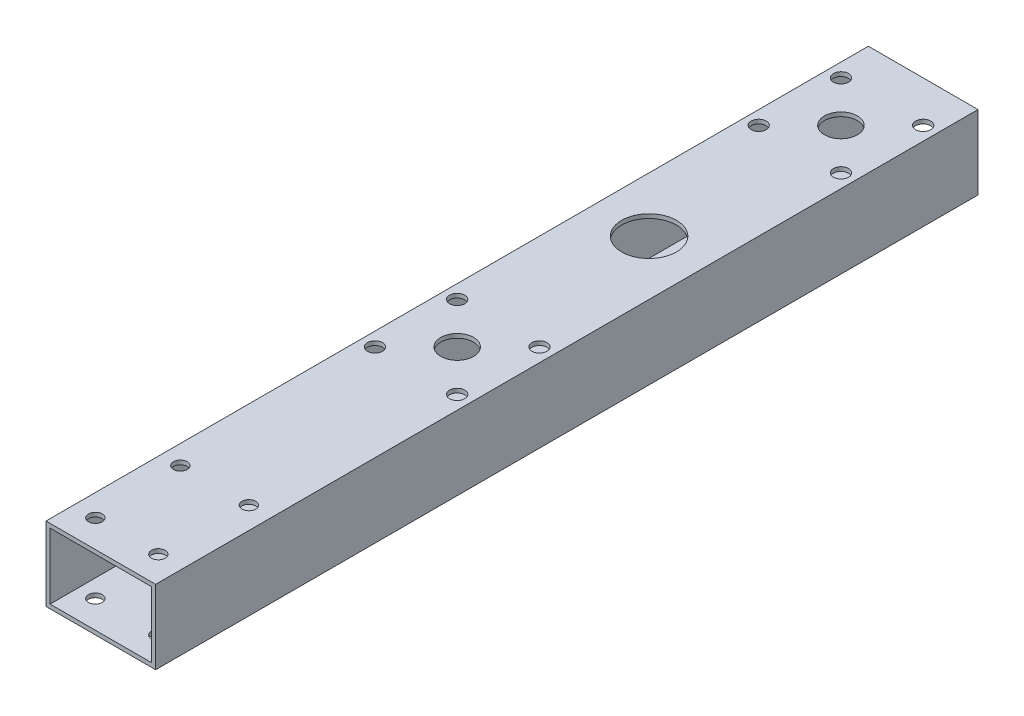
ISO-10303-21;
HEADER;
FILE_DESCRIPTION(('STEP AP214'),'2;1');
FILE_NAME('part.step','',(''),(''),'','','');
FILE_SCHEMA(('AUTOMOTIVE_DESIGN { 1 0 10303 214 1 1 1 1 }'));
ENDSEC;
DATA;
#1=APPLICATION_CONTEXT('core data for automotive mechanical design processes');
#2=APPLICATION_PROTOCOL_DEFINITION('international standard','automotive_design',2000,#1);
#3=PRODUCT_CONTEXT('',#1,'mechanical');
#4=PRODUCT('Part','Part','',(#3));
#5=PRODUCT_RELATED_PRODUCT_CATEGORY('part','',(#4));
#6=PRODUCT_DEFINITION_FORMATION('','',#4);
#7=PRODUCT_DEFINITION_CONTEXT('part definition',#1,'design');
#8=PRODUCT_DEFINITION('design','',#6,#7);
#9=PRODUCT_DEFINITION_SHAPE('','',#8);
#10=(LENGTH_UNIT() NAMED_UNIT(*) SI_UNIT(.MILLI.,.METRE.));
#11=(NAMED_UNIT(*) PLANE_ANGLE_UNIT() SI_UNIT($,.RADIAN.));
#12=(NAMED_UNIT(*) SI_UNIT($,.STERADIAN.) SOLID_ANGLE_UNIT());
#13=UNCERTAINTY_MEASURE_WITH_UNIT(LENGTH_MEASURE(1.E-05),#10,'distance_accuracy_value','');
#14=(GEOMETRIC_REPRESENTATION_CONTEXT(3) GLOBAL_UNCERTAINTY_ASSIGNED_CONTEXT((#13)) GLOBAL_UNIT_ASSIGNED_CONTEXT((#10,
#11,#12)) REPRESENTATION_CONTEXT('',''));
#15=CARTESIAN_POINT('',(0.,0.,0.));
#16=DIRECTION('',(0.,0.,1.));
#17=DIRECTION('',(1.,0.,0.));
#18=AXIS2_PLACEMENT_3D('',#15,#16,#17);
#19=CARTESIAN_POINT('',(0.,0.,300.));
#20=DIRECTION('',(0.,1.,0.));
#21=DIRECTION('',(0.,0.,1.));
#22=AXIS2_PLACEMENT_3D('',#19,#20,#21);
#23=PLANE('',#22);
#24=CARTESIAN_POINT('',(20.,0.,170.));
#25=DIRECTION('',(0.,1.,0.));
#26=DIRECTION('',(0.,0.,-1.));
#27=AXIS2_PLACEMENT_3D('',#24,#25,#26);
#28=CIRCLE('',#27,6.00000000000001);
#29=CARTESIAN_POINT('',(20.,0.,164.));
#30=VERTEX_POINT('',#29);
#31=EDGE_CURVE('E238',#30,#30,#28,.T.);
#32=ORIENTED_EDGE('',*,*,#31,.T.);
#33=EDGE_LOOP('',(#32));
#34=FACE_BOUND('',#33,.T.);
#35=CARTESIAN_POINT('',(5.,0.,45.));
#36=DIRECTION('',(0.,1.,0.));
#37=DIRECTION('',(0.,0.,1.));
#38=AXIS2_PLACEMENT_3D('',#35,#36,#37);
#39=CIRCLE('',#38,2.75);
#40=CARTESIAN_POINT('',(5.,0.,47.75));
#41=VERTEX_POINT('',#40);
#42=EDGE_CURVE('E254',#41,#41,#39,.T.);
#43=ORIENTED_EDGE('',*,*,#42,.T.);
#44=EDGE_LOOP('',(#43));
#45=FACE_BOUND('',#44,.T.);
#46=CARTESIAN_POINT('',(35.,0.,15.));
#47=DIRECTION('',(0.,1.,0.));
#48=DIRECTION('',(0.,0.,1.));
#49=AXIS2_PLACEMENT_3D('',#46,#47,#48);
#50=CIRCLE('',#49,2.75);
#51=CARTESIAN_POINT('',(35.,0.,17.75));
#52=VERTEX_POINT('',#51);
#53=EDGE_CURVE('E268',#52,#52,#50,.T.);
#54=ORIENTED_EDGE('',*,*,#53,.T.);
#55=EDGE_LOOP('',(#54));
#56=FACE_BOUND('',#55,.T.);
#57=CARTESIAN_POINT('',(35.,0.,185.));
#58=DIRECTION('',(0.,1.,0.));
#59=DIRECTION('',(0.,0.,-1.));
#60=AXIS2_PLACEMENT_3D('',#57,#58,#59);
#61=CIRCLE('',#60,2.75);
#62=CARTESIAN_POINT('',(35.,0.,182.25));
#63=VERTEX_POINT('',#62);
#64=EDGE_CURVE('E282',#63,#63,#61,.T.);
#65=ORIENTED_EDGE('',*,*,#64,.T.);
#66=EDGE_LOOP('',(#65));
#67=FACE_BOUND('',#66,.T.);
#68=CARTESIAN_POINT('',(20.,0.,100.));
#69=DIRECTION('',(0.,1.,0.));
#70=DIRECTION('',(0.,0.,1.));
#71=AXIS2_PLACEMENT_3D('',#68,#69,#70);
#72=CIRCLE('',#71,10.);
#73=CARTESIAN_POINT('',(20.,0.,110.));
#74=VERTEX_POINT('',#73);
#75=EDGE_CURVE('E296',#74,#74,#72,.T.);
#76=ORIENTED_EDGE('',*,*,#75,.T.);
#77=EDGE_LOOP('',(#76));
#78=FACE_BOUND('',#77,.T.);
#79=CARTESIAN_POINT('',(31.,0.,290.));
#80=DIRECTION('',(0.,1.,0.));
#81=DIRECTION('',(0.,0.,-1.));
#82=AXIS2_PLACEMENT_3D('',#79,#80,#81);
#83=CIRCLE('',#82,2.5);
#84=CARTESIAN_POINT('',(31.,0.,287.5));
#85=VERTEX_POINT('',#84);
#86=EDGE_CURVE('E310',#85,#85,#83,.T.);
#87=ORIENTED_EDGE('',*,*,#86,.T.);
#88=EDGE_LOOP('',(#87));
#89=FACE_BOUND('',#88,.T.);
#90=CARTESIAN_POINT('',(32.,0.,258.));
#91=DIRECTION('',(0.,1.,0.));
#92=DIRECTION('',(0.,0.,1.));
#93=AXIS2_PLACEMENT_3D('',#90,#91,#92);
#94=CIRCLE('',#93,2.5);
#95=CARTESIAN_POINT('',(32.,0.,260.5));
#96=VERTEX_POINT('',#95);
#97=EDGE_CURVE('E324',#96,#96,#94,.T.);
#98=ORIENTED_EDGE('',*,*,#97,.T.);
#99=EDGE_LOOP('',(#98));
#100=FACE_BOUND('',#99,.T.);
#101=DIRECTION('',(1.,0.,0.));
#102=VECTOR('',#101,1.);
#103=CARTESIAN_POINT('',(0.,0.,0.));
#104=LINE('',#103,#102);
#105=CARTESIAN_POINT('',(0.,0.,0.));
#106=VERTEX_POINT('',#105);
#107=CARTESIAN_POINT('',(40.,0.,0.));
#108=VERTEX_POINT('',#107);
#109=EDGE_CURVE('E153',#106,#108,#104,.T.);
#110=ORIENTED_EDGE('',*,*,#109,.T.);
#111=DIRECTION('',(0.,0.,-1.));
#112=VECTOR('',#111,1.);
#113=CARTESIAN_POINT('',(40.,0.,300.));
#114=LINE('',#113,#112);
#115=CARTESIAN_POINT('',(40.,0.,300.));
#116=VERTEX_POINT('',#115);
#117=EDGE_CURVE('E42',#116,#108,#114,.T.);
#118=ORIENTED_EDGE('',*,*,#117,.F.);
#119=DIRECTION('',(1.,0.,0.));
#120=VECTOR('',#119,1.);
#121=CARTESIAN_POINT('',(0.,0.,300.));
#122=LINE('',#121,#120);
#123=CARTESIAN_POINT('',(0.,0.,300.));
#124=VERTEX_POINT('',#123);
#125=EDGE_CURVE('E143',#124,#116,#122,.T.);
#126=ORIENTED_EDGE('',*,*,#125,.F.);
#127=DIRECTION('',(0.,0.,-1.));
#128=VECTOR('',#127,1.);
#129=CARTESIAN_POINT('',(0.,0.,300.));
#130=LINE('',#129,#128);
#131=EDGE_CURVE('E11',#124,#106,#130,.T.);
#132=ORIENTED_EDGE('',*,*,#131,.T.);
#133=EDGE_LOOP('',(#110,#118,#126,#132));
#134=FACE_BOUND('',#133,.T.);
#135=CARTESIAN_POINT('',(8.,0.,290.));
#136=DIRECTION('',(0.,1.,0.));
#137=DIRECTION('',(0.,0.,1.));
#138=AXIS2_PLACEMENT_3D('',#135,#136,#137);
#139=CIRCLE('',#138,2.5);
#140=CARTESIAN_POINT('',(8.,0.,292.5));
#141=VERTEX_POINT('',#140);
#142=EDGE_CURVE('E331',#141,#141,#139,.T.);
#143=ORIENTED_EDGE('',*,*,#142,.T.);
#144=EDGE_LOOP('',(#143));
#145=FACE_BOUND('',#144,.T.);
#146=CARTESIAN_POINT('',(7.,0.,258.));
#147=DIRECTION('',(0.,1.,0.));
#148=DIRECTION('',(0.,0.,-1.));
#149=AXIS2_PLACEMENT_3D('',#146,#147,#148);
#150=CIRCLE('',#149,2.5);
#151=CARTESIAN_POINT('',(7.,0.,255.5));
#152=VERTEX_POINT('',#151);
#153=EDGE_CURVE('E317',#152,#152,#150,.T.);
#154=ORIENTED_EDGE('',*,*,#153,.T.);
#155=EDGE_LOOP('',(#154));
#156=FACE_BOUND('',#155,.T.);
#157=CARTESIAN_POINT('',(20.,0.,30.));
#158=DIRECTION('',(0.,1.,0.));
#159=DIRECTION('',(0.,0.,1.));
#160=AXIS2_PLACEMENT_3D('',#157,#158,#159);
#161=CIRCLE('',#160,6.00000000000001);
#162=CARTESIAN_POINT('',(20.,0.,36.));
#163=VERTEX_POINT('',#162);
#164=EDGE_CURVE('E303',#163,#163,#161,.T.);
#165=ORIENTED_EDGE('',*,*,#164,.T.);
#166=EDGE_LOOP('',(#165));
#167=FACE_BOUND('',#166,.T.);
#168=CARTESIAN_POINT('',(4.99999999999997,0.,185.));
#169=DIRECTION('',(0.,1.,0.));
#170=DIRECTION('',(0.,0.,-1.));
#171=AXIS2_PLACEMENT_3D('',#168,#169,#170);
#172=CIRCLE('',#171,2.75);
#173=CARTESIAN_POINT('',(4.99999999999997,0.,182.25));
#174=VERTEX_POINT('',#173);
#175=EDGE_CURVE('E289',#174,#174,#172,.T.);
#176=ORIENTED_EDGE('',*,*,#175,.T.);
#177=EDGE_LOOP('',(#176));
#178=FACE_BOUND('',#177,.T.);
#179=CARTESIAN_POINT('',(5.,0.,15.));
#180=DIRECTION('',(0.,1.,0.));
#181=DIRECTION('',(0.,0.,1.));
#182=AXIS2_PLACEMENT_3D('',#179,#180,#181);
#183=CIRCLE('',#182,2.75);
#184=CARTESIAN_POINT('',(5.,0.,17.75));
#185=VERTEX_POINT('',#184);
#186=EDGE_CURVE('E275',#185,#185,#183,.T.);
#187=ORIENTED_EDGE('',*,*,#186,.T.);
#188=EDGE_LOOP('',(#187));
#189=FACE_BOUND('',#188,.T.);
#190=CARTESIAN_POINT('',(35.,0.,45.));
#191=DIRECTION('',(0.,1.,0.));
#192=DIRECTION('',(0.,0.,1.));
#193=AXIS2_PLACEMENT_3D('',#190,#191,#192);
#194=CIRCLE('',#193,2.75);
#195=CARTESIAN_POINT('',(35.,0.,47.75));
#196=VERTEX_POINT('',#195);
#197=EDGE_CURVE('E261',#196,#196,#194,.T.);
#198=ORIENTED_EDGE('',*,*,#197,.T.);
#199=EDGE_LOOP('',(#198));
#200=FACE_BOUND('',#199,.T.);
#201=CARTESIAN_POINT('',(35.,0.,155.));
#202=DIRECTION('',(0.,1.,0.));
#203=DIRECTION('',(0.,0.,-1.));
#204=AXIS2_PLACEMENT_3D('',#201,#202,#203);
#205=CIRCLE('',#204,2.75);
#206=CARTESIAN_POINT('',(35.,0.,152.25));
#207=VERTEX_POINT('',#206);
#208=EDGE_CURVE('E235',#207,#207,#205,.T.);
#209=ORIENTED_EDGE('',*,*,#208,.T.);
#210=EDGE_LOOP('',(#209));
#211=FACE_BOUND('',#210,.T.);
#212=CARTESIAN_POINT('',(4.99999999999997,0.,155.));
#213=DIRECTION('',(0.,1.,0.));
#214=DIRECTION('',(0.,0.,-1.));
#215=AXIS2_PLACEMENT_3D('',#212,#213,#214);
#216=CIRCLE('',#215,2.75);
#217=CARTESIAN_POINT('',(4.99999999999997,0.,152.25));
#218=VERTEX_POINT('',#217);
#219=EDGE_CURVE('E365',#218,#218,#216,.T.);
#220=ORIENTED_EDGE('',*,*,#219,.T.);
#221=EDGE_LOOP('',(#220));
#222=FACE_BOUND('',#221,.T.);
#223=ADVANCED_FACE('F33',(#34,#45,#56,#67,#78,#89,#100,#134,#145,#156,#167,#178,#189,#200,#211,
#222),#23,.F.);
#224=CARTESIAN_POINT('',(0.,27.,300.));
#225=DIRECTION('',(0.,-1.,0.));
#226=DIRECTION('',(0.,0.,-1.));
#227=AXIS2_PLACEMENT_3D('',#224,#225,#226);
#228=PLANE('',#227);
#229=CARTESIAN_POINT('',(20.,27.,170.));
#230=DIRECTION('',(0.,1.,0.));
#231=DIRECTION('',(0.,0.,-1.));
#232=AXIS2_PLACEMENT_3D('',#229,#230,#231);
#233=CIRCLE('',#232,6.00000000000001);
#234=CARTESIAN_POINT('',(20.,27.,164.));
#235=VERTEX_POINT('',#234);
#236=EDGE_CURVE('E231',#235,#235,#233,.T.);
#237=ORIENTED_EDGE('',*,*,#236,.F.);
#238=EDGE_LOOP('',(#237));
#239=FACE_BOUND('',#238,.T.);
#240=CARTESIAN_POINT('',(5.,27.,45.));
#241=DIRECTION('',(0.,1.,0.));
#242=DIRECTION('',(0.,0.,1.));
#243=AXIS2_PLACEMENT_3D('',#240,#241,#242);
#244=CIRCLE('',#243,2.75);
#245=CARTESIAN_POINT('',(5.,27.,47.75));
#246=VERTEX_POINT('',#245);
#247=EDGE_CURVE('E223',#246,#246,#244,.T.);
#248=ORIENTED_EDGE('',*,*,#247,.F.);
#249=EDGE_LOOP('',(#248));
#250=FACE_BOUND('',#249,.T.);
#251=CARTESIAN_POINT('',(35.,27.,15.));
#252=DIRECTION('',(0.,1.,0.));
#253=DIRECTION('',(0.,0.,1.));
#254=AXIS2_PLACEMENT_3D('',#251,#252,#253);
#255=CIRCLE('',#254,2.75);
#256=CARTESIAN_POINT('',(35.,27.,17.75));
#257=VERTEX_POINT('',#256);
#258=EDGE_CURVE('E213',#257,#257,#255,.T.);
#259=ORIENTED_EDGE('',*,*,#258,.F.);
#260=EDGE_LOOP('',(#259));
#261=FACE_BOUND('',#260,.T.);
#262=CARTESIAN_POINT('',(35.,27.,185.));
#263=DIRECTION('',(0.,1.,0.));
#264=DIRECTION('',(0.,0.,-1.));
#265=AXIS2_PLACEMENT_3D('',#262,#263,#264);
#266=CIRCLE('',#265,2.75);
#267=CARTESIAN_POINT('',(35.,27.,182.25));
#268=VERTEX_POINT('',#267);
#269=EDGE_CURVE('E203',#268,#268,#266,.T.);
#270=ORIENTED_EDGE('',*,*,#269,.F.);
#271=EDGE_LOOP('',(#270));
#272=FACE_BOUND('',#271,.T.);
#273=CARTESIAN_POINT('',(20.,27.,100.));
#274=DIRECTION('',(0.,1.,0.));
#275=DIRECTION('',(0.,0.,1.));
#276=AXIS2_PLACEMENT_3D('',#273,#274,#275);
#277=CIRCLE('',#276,10.);
#278=CARTESIAN_POINT('',(20.,27.,110.));
#279=VERTEX_POINT('',#278);
#280=EDGE_CURVE('E193',#279,#279,#277,.T.);
#281=ORIENTED_EDGE('',*,*,#280,.F.);
#282=EDGE_LOOP('',(#281));
#283=FACE_BOUND('',#282,.T.);
#284=CARTESIAN_POINT('',(31.,27.,290.));
#285=DIRECTION('',(0.,1.,0.));
#286=DIRECTION('',(0.,0.,-1.));
#287=AXIS2_PLACEMENT_3D('',#284,#285,#286);
#288=CIRCLE('',#287,2.5);
#289=CARTESIAN_POINT('',(31.,27.,287.5));
#290=VERTEX_POINT('',#289);
#291=EDGE_CURVE('E183',#290,#290,#288,.T.);
#292=ORIENTED_EDGE('',*,*,#291,.F.);
#293=EDGE_LOOP('',(#292));
#294=FACE_BOUND('',#293,.T.);
#295=CARTESIAN_POINT('',(32.,27.,258.));
#296=DIRECTION('',(0.,1.,0.));
#297=DIRECTION('',(0.,0.,1.));
#298=AXIS2_PLACEMENT_3D('',#295,#296,#297);
#299=CIRCLE('',#298,2.5);
#300=CARTESIAN_POINT('',(32.,27.,260.5));
#301=VERTEX_POINT('',#300);
#302=EDGE_CURVE('E173',#301,#301,#299,.T.);
#303=ORIENTED_EDGE('',*,*,#302,.F.);
#304=EDGE_LOOP('',(#303));
#305=FACE_BOUND('',#304,.T.);
#306=DIRECTION('',(-1.,0.,0.));
#307=VECTOR('',#306,1.);
#308=CARTESIAN_POINT('',(0.,27.,0.));
#309=LINE('',#308,#307);
#310=CARTESIAN_POINT('',(40.,27.,0.));
#311=VERTEX_POINT('',#310);
#312=CARTESIAN_POINT('',(0.,27.,0.));
#313=VERTEX_POINT('',#312);
#314=EDGE_CURVE('E144',#311,#313,#309,.T.);
#315=ORIENTED_EDGE('',*,*,#314,.T.);
#316=DIRECTION('',(0.,0.,-1.));
#317=VECTOR('',#316,1.);
#318=CARTESIAN_POINT('',(0.,27.,300.));
#319=LINE('',#318,#317);
#320=CARTESIAN_POINT('',(0.,27.,300.));
#321=VERTEX_POINT('',#320);
#322=EDGE_CURVE('E150',#321,#313,#319,.T.);
#323=ORIENTED_EDGE('',*,*,#322,.F.);
#324=DIRECTION('',(-1.,0.,0.));
#325=VECTOR('',#324,1.);
#326=CARTESIAN_POINT('',(0.,27.,300.));
#327=LINE('',#326,#325);
#328=CARTESIAN_POINT('',(40.,27.,300.));
#329=VERTEX_POINT('',#328);
#330=EDGE_CURVE('E148',#329,#321,#327,.T.);
#331=ORIENTED_EDGE('',*,*,#330,.F.);
#332=DIRECTION('',(0.,0.,-1.));
#333=VECTOR('',#332,1.);
#334=CARTESIAN_POINT('',(40.,27.,300.));
#335=LINE('',#334,#333);
#336=EDGE_CURVE('E160',#329,#311,#335,.T.);
#337=ORIENTED_EDGE('',*,*,#336,.T.);
#338=EDGE_LOOP('',(#315,#323,#331,#337));
#339=FACE_BOUND('',#338,.T.);
#340=CARTESIAN_POINT('',(8.,27.,290.));
#341=DIRECTION('',(0.,1.,0.));
#342=DIRECTION('',(0.,0.,1.));
#343=AXIS2_PLACEMENT_3D('',#340,#341,#342);
#344=CIRCLE('',#343,2.5);
#345=CARTESIAN_POINT('',(8.,27.,292.5));
#346=VERTEX_POINT('',#345);
#347=EDGE_CURVE('E168',#346,#346,#344,.T.);
#348=ORIENTED_EDGE('',*,*,#347,.F.);
#349=EDGE_LOOP('',(#348));
#350=FACE_BOUND('',#349,.T.);
#351=CARTESIAN_POINT('',(7.,27.,258.));
#352=DIRECTION('',(0.,1.,0.));
#353=DIRECTION('',(0.,0.,-1.));
#354=AXIS2_PLACEMENT_3D('',#351,#352,#353);
#355=CIRCLE('',#354,2.5);
#356=CARTESIAN_POINT('',(7.,27.,255.5));
#357=VERTEX_POINT('',#356);
#358=EDGE_CURVE('E178',#357,#357,#355,.T.);
#359=ORIENTED_EDGE('',*,*,#358,.F.);
#360=EDGE_LOOP('',(#359));
#361=FACE_BOUND('',#360,.T.);
#362=CARTESIAN_POINT('',(20.,27.,30.));
#363=DIRECTION('',(0.,1.,0.));
#364=DIRECTION('',(0.,0.,1.));
#365=AXIS2_PLACEMENT_3D('',#362,#363,#364);
#366=CIRCLE('',#365,6.00000000000001);
#367=CARTESIAN_POINT('',(20.,27.,36.));
#368=VERTEX_POINT('',#367);
#369=EDGE_CURVE('E188',#368,#368,#366,.T.);
#370=ORIENTED_EDGE('',*,*,#369,.F.);
#371=EDGE_LOOP('',(#370));
#372=FACE_BOUND('',#371,.T.);
#373=CARTESIAN_POINT('',(4.99999999999997,27.,185.));
#374=DIRECTION('',(0.,1.,0.));
#375=DIRECTION('',(0.,0.,-1.));
#376=AXIS2_PLACEMENT_3D('',#373,#374,#375);
#377=CIRCLE('',#376,2.75);
#378=CARTESIAN_POINT('',(4.99999999999997,27.,182.25));
#379=VERTEX_POINT('',#378);
#380=EDGE_CURVE('E198',#379,#379,#377,.T.);
#381=ORIENTED_EDGE('',*,*,#380,.F.);
#382=EDGE_LOOP('',(#381));
#383=FACE_BOUND('',#382,.T.);
#384=CARTESIAN_POINT('',(5.,27.,15.));
#385=DIRECTION('',(0.,1.,0.));
#386=DIRECTION('',(0.,0.,1.));
#387=AXIS2_PLACEMENT_3D('',#384,#385,#386);
#388=CIRCLE('',#387,2.75);
#389=CARTESIAN_POINT('',(5.,27.,17.75));
#390=VERTEX_POINT('',#389);
#391=EDGE_CURVE('E208',#390,#390,#388,.T.);
#392=ORIENTED_EDGE('',*,*,#391,.F.);
#393=EDGE_LOOP('',(#392));
#394=FACE_BOUND('',#393,.T.);
#395=CARTESIAN_POINT('',(35.,27.,45.));
#396=DIRECTION('',(0.,1.,0.));
#397=DIRECTION('',(0.,0.,1.));
#398=AXIS2_PLACEMENT_3D('',#395,#396,#397);
#399=CIRCLE('',#398,2.75);
#400=CARTESIAN_POINT('',(35.,27.,47.75));
#401=VERTEX_POINT('',#400);
#402=EDGE_CURVE('E218',#401,#401,#399,.T.);
#403=ORIENTED_EDGE('',*,*,#402,.F.);
#404=EDGE_LOOP('',(#403));
#405=FACE_BOUND('',#404,.T.);
#406=CARTESIAN_POINT('',(35.,27.,155.));
#407=DIRECTION('',(0.,1.,0.));
#408=DIRECTION('',(0.,0.,-1.));
#409=AXIS2_PLACEMENT_3D('',#406,#407,#408);
#410=CIRCLE('',#409,2.75);
#411=CARTESIAN_POINT('',(35.,27.,152.25));
#412=VERTEX_POINT('',#411);
#413=EDGE_CURVE('E227',#412,#412,#410,.T.);
#414=ORIENTED_EDGE('',*,*,#413,.F.);
#415=EDGE_LOOP('',(#414));
#416=FACE_BOUND('',#415,.T.);
#417=CARTESIAN_POINT('',(4.99999999999997,27.,155.));
#418=DIRECTION('',(0.,1.,0.));
#419=DIRECTION('',(0.,0.,-1.));
#420=AXIS2_PLACEMENT_3D('',#417,#418,#419);
#421=CIRCLE('',#420,2.75);
#422=CARTESIAN_POINT('',(4.99999999999997,27.,152.25));
#423=VERTEX_POINT('',#422);
#424=EDGE_CURVE('E367',#423,#423,#421,.T.);
#425=ORIENTED_EDGE('',*,*,#424,.F.);
#426=EDGE_LOOP('',(#425));
#427=FACE_BOUND('',#426,.T.);
#428=ADVANCED_FACE('F349',(#239,#250,#261,#272,#283,#294,#305,#339,#350,#361,#372,#383,#394,
#405,#416,#427),#228,.F.);
#429=CARTESIAN_POINT('',(1.5,1.5,300.));
#430=DIRECTION('',(0.,1.,0.));
#431=DIRECTION('',(0.,0.,1.));
#432=AXIS2_PLACEMENT_3D('',#429,#430,#431);
#433=PLANE('',#432);
#434=CARTESIAN_POINT('',(20.,1.5,170.));
#435=DIRECTION('',(0.,1.,0.));
#436=DIRECTION('',(0.,0.,1.));
#437=AXIS2_PLACEMENT_3D('',#434,#435,#436);
#438=CIRCLE('',#437,6.00000000000001);
#439=CARTESIAN_POINT('',(20.,1.5,176.));
#440=VERTEX_POINT('',#439);
#441=EDGE_CURVE('E230',#440,#440,#438,.F.);
#442=ORIENTED_EDGE('',*,*,#441,.T.);
#443=EDGE_LOOP('',(#442));
#444=FACE_BOUND('',#443,.T.);
#445=CARTESIAN_POINT('',(5.,1.5,45.));
#446=DIRECTION('',(0.,1.,0.));
#447=DIRECTION('',(0.,0.,1.));
#448=AXIS2_PLACEMENT_3D('',#445,#446,#447);
#449=CIRCLE('',#448,2.75);
#450=CARTESIAN_POINT('',(5.,1.5,47.75));
#451=VERTEX_POINT('',#450);
#452=EDGE_CURVE('E222',#451,#451,#449,.F.);
#453=ORIENTED_EDGE('',*,*,#452,.T.);
#454=EDGE_LOOP('',(#453));
#455=FACE_BOUND('',#454,.T.);
#456=CARTESIAN_POINT('',(35.,1.5,15.));
#457=DIRECTION('',(0.,1.,0.));
#458=DIRECTION('',(0.,0.,1.));
#459=AXIS2_PLACEMENT_3D('',#456,#457,#458);
#460=CIRCLE('',#459,2.75);
#461=CARTESIAN_POINT('',(35.,1.5,17.75));
#462=VERTEX_POINT('',#461);
#463=EDGE_CURVE('E212',#462,#462,#460,.F.);
#464=ORIENTED_EDGE('',*,*,#463,.T.);
#465=EDGE_LOOP('',(#464));
#466=FACE_BOUND('',#465,.T.);
#467=CARTESIAN_POINT('',(35.,1.5,185.));
#468=DIRECTION('',(0.,1.,0.));
#469=DIRECTION('',(0.,0.,1.));
#470=AXIS2_PLACEMENT_3D('',#467,#468,#469);
#471=CIRCLE('',#470,2.75);
#472=CARTESIAN_POINT('',(35.,1.5,187.75));
#473=VERTEX_POINT('',#472);
#474=EDGE_CURVE('E202',#473,#473,#471,.F.);
#475=ORIENTED_EDGE('',*,*,#474,.T.);
#476=EDGE_LOOP('',(#475));
#477=FACE_BOUND('',#476,.T.);
#478=CARTESIAN_POINT('',(20.,1.5,100.));
#479=DIRECTION('',(0.,1.,0.));
#480=DIRECTION('',(0.,0.,1.));
#481=AXIS2_PLACEMENT_3D('',#478,#479,#480);
#482=CIRCLE('',#481,10.);
#483=CARTESIAN_POINT('',(20.,1.5,110.));
#484=VERTEX_POINT('',#483);
#485=EDGE_CURVE('E192',#484,#484,#482,.F.);
#486=ORIENTED_EDGE('',*,*,#485,.T.);
#487=EDGE_LOOP('',(#486));
#488=FACE_BOUND('',#487,.T.);
#489=CARTESIAN_POINT('',(31.,1.5,290.));
#490=DIRECTION('',(0.,1.,0.));
#491=DIRECTION('',(0.,0.,1.));
#492=AXIS2_PLACEMENT_3D('',#489,#490,#491);
#493=CIRCLE('',#492,2.5);
#494=CARTESIAN_POINT('',(31.,1.5,292.5));
#495=VERTEX_POINT('',#494);
#496=EDGE_CURVE('E182',#495,#495,#493,.F.);
#497=ORIENTED_EDGE('',*,*,#496,.T.);
#498=EDGE_LOOP('',(#497));
#499=FACE_BOUND('',#498,.T.);
#500=CARTESIAN_POINT('',(32.,1.5,258.));
#501=DIRECTION('',(0.,1.,0.));
#502=DIRECTION('',(0.,0.,1.));
#503=AXIS2_PLACEMENT_3D('',#500,#501,#502);
#504=CIRCLE('',#503,2.5);
#505=CARTESIAN_POINT('',(32.,1.5,260.5));
#506=VERTEX_POINT('',#505);
#507=EDGE_CURVE('E172',#506,#506,#504,.F.);
#508=ORIENTED_EDGE('',*,*,#507,.T.);
#509=EDGE_LOOP('',(#508));
#510=FACE_BOUND('',#509,.T.);
#511=DIRECTION('',(1.,0.,0.));
#512=VECTOR('',#511,1.);
#513=CARTESIAN_POINT('',(1.5,1.5,0.));
#514=LINE('',#513,#512);
#515=CARTESIAN_POINT('',(1.5,1.5,0.));
#516=VERTEX_POINT('',#515);
#517=CARTESIAN_POINT('',(38.5,1.5,0.));
#518=VERTEX_POINT('',#517);
#519=EDGE_CURVE('E116',#516,#518,#514,.T.);
#520=ORIENTED_EDGE('',*,*,#519,.F.);
#521=DIRECTION('',(0.,0.,-1.));
#522=VECTOR('',#521,1.);
#523=CARTESIAN_POINT('',(1.5,1.5,300.));
#524=LINE('',#523,#522);
#525=CARTESIAN_POINT('',(1.5,1.5,300.));
#526=VERTEX_POINT('',#525);
#527=EDGE_CURVE('E103',#526,#516,#524,.T.);
#528=ORIENTED_EDGE('',*,*,#527,.F.);
#529=DIRECTION('',(1.,0.,0.));
#530=VECTOR('',#529,1.);
#531=CARTESIAN_POINT('',(1.5,1.5,300.));
#532=LINE('',#531,#530);
#533=CARTESIAN_POINT('',(38.5,1.5,300.));
#534=VERTEX_POINT('',#533);
#535=EDGE_CURVE('E108',#526,#534,#532,.T.);
#536=ORIENTED_EDGE('',*,*,#535,.T.);
#537=DIRECTION('',(0.,0.,-1.));
#538=VECTOR('',#537,1.);
#539=CARTESIAN_POINT('',(38.5,1.5,300.));
#540=LINE('',#539,#538);
#541=EDGE_CURVE('E118',#534,#518,#540,.T.);
#542=ORIENTED_EDGE('',*,*,#541,.T.);
#543=EDGE_LOOP('',(#520,#528,#536,#542));
#544=FACE_BOUND('',#543,.T.);
#545=CARTESIAN_POINT('',(8.,1.5,290.));
#546=DIRECTION('',(0.,1.,0.));
#547=DIRECTION('',(0.,0.,1.));
#548=AXIS2_PLACEMENT_3D('',#545,#546,#547);
#549=CIRCLE('',#548,2.5);
#550=CARTESIAN_POINT('',(8.,1.5,292.5));
#551=VERTEX_POINT('',#550);
#552=EDGE_CURVE('E130',#551,#551,#549,.F.);
#553=ORIENTED_EDGE('',*,*,#552,.T.);
#554=EDGE_LOOP('',(#553));
#555=FACE_BOUND('',#554,.T.);
#556=CARTESIAN_POINT('',(7.,1.5,258.));
#557=DIRECTION('',(0.,1.,0.));
#558=DIRECTION('',(0.,0.,1.));
#559=AXIS2_PLACEMENT_3D('',#556,#557,#558);
#560=CIRCLE('',#559,2.5);
#561=CARTESIAN_POINT('',(7.,1.5,260.5));
#562=VERTEX_POINT('',#561);
#563=EDGE_CURVE('E177',#562,#562,#560,.F.);
#564=ORIENTED_EDGE('',*,*,#563,.T.);
#565=EDGE_LOOP('',(#564));
#566=FACE_BOUND('',#565,.T.);
#567=CARTESIAN_POINT('',(20.,1.5,30.));
#568=DIRECTION('',(0.,1.,0.));
#569=DIRECTION('',(0.,0.,1.));
#570=AXIS2_PLACEMENT_3D('',#567,#568,#569);
#571=CIRCLE('',#570,6.00000000000001);
#572=CARTESIAN_POINT('',(20.,1.5,36.));
#573=VERTEX_POINT('',#572);
#574=EDGE_CURVE('E187',#573,#573,#571,.F.);
#575=ORIENTED_EDGE('',*,*,#574,.T.);
#576=EDGE_LOOP('',(#575));
#577=FACE_BOUND('',#576,.T.);
#578=CARTESIAN_POINT('',(4.99999999999997,1.5,185.));
#579=DIRECTION('',(0.,1.,0.));
#580=DIRECTION('',(0.,0.,1.));
#581=AXIS2_PLACEMENT_3D('',#578,#579,#580);
#582=CIRCLE('',#581,2.75);
#583=CARTESIAN_POINT('',(4.99999999999997,1.5,187.75));
#584=VERTEX_POINT('',#583);
#585=EDGE_CURVE('E197',#584,#584,#582,.F.);
#586=ORIENTED_EDGE('',*,*,#585,.T.);
#587=EDGE_LOOP('',(#586));
#588=FACE_BOUND('',#587,.T.);
#589=CARTESIAN_POINT('',(5.,1.5,15.));
#590=DIRECTION('',(0.,1.,0.));
#591=DIRECTION('',(0.,0.,1.));
#592=AXIS2_PLACEMENT_3D('',#589,#590,#591);
#593=CIRCLE('',#592,2.75);
#594=CARTESIAN_POINT('',(5.,1.5,17.75));
#595=VERTEX_POINT('',#594);
#596=EDGE_CURVE('E207',#595,#595,#593,.F.);
#597=ORIENTED_EDGE('',*,*,#596,.T.);
#598=EDGE_LOOP('',(#597));
#599=FACE_BOUND('',#598,.T.);
#600=CARTESIAN_POINT('',(35.,1.5,45.));
#601=DIRECTION('',(0.,1.,0.));
#602=DIRECTION('',(0.,0.,1.));
#603=AXIS2_PLACEMENT_3D('',#600,#601,#602);
#604=CIRCLE('',#603,2.75);
#605=CARTESIAN_POINT('',(35.,1.5,47.75));
#606=VERTEX_POINT('',#605);
#607=EDGE_CURVE('E217',#606,#606,#604,.F.);
#608=ORIENTED_EDGE('',*,*,#607,.T.);
#609=EDGE_LOOP('',(#608));
#610=FACE_BOUND('',#609,.T.);
#611=CARTESIAN_POINT('',(35.,1.5,155.));
#612=DIRECTION('',(0.,1.,0.));
#613=DIRECTION('',(0.,0.,1.));
#614=AXIS2_PLACEMENT_3D('',#611,#612,#613);
#615=CIRCLE('',#614,2.75);
#616=CARTESIAN_POINT('',(35.,1.5,157.75));
#617=VERTEX_POINT('',#616);
#618=EDGE_CURVE('E226',#617,#617,#615,.F.);
#619=ORIENTED_EDGE('',*,*,#618,.T.);
#620=EDGE_LOOP('',(#619));
#621=FACE_BOUND('',#620,.T.);
#622=CARTESIAN_POINT('',(4.99999999999997,1.5,155.));
#623=DIRECTION('',(0.,1.,0.));
#624=DIRECTION('',(0.,0.,1.));
#625=AXIS2_PLACEMENT_3D('',#622,#623,#624);
#626=CIRCLE('',#625,2.75);
#627=CARTESIAN_POINT('',(4.99999999999997,1.5,157.75));
#628=VERTEX_POINT('',#627);
#629=EDGE_CURVE('E243',#628,#628,#626,.F.);
#630=ORIENTED_EDGE('',*,*,#629,.T.);
#631=EDGE_LOOP('',(#630));
#632=FACE_BOUND('',#631,.T.);
#633=ADVANCED_FACE('F112',(#444,#455,#466,#477,#488,#499,#510,#544,#555,#566,#577,#588,#599,
#610,#621,#632),#433,.T.);
#634=CARTESIAN_POINT('',(1.5,25.5,300.));
#635=DIRECTION('',(0.,-1.,0.));
#636=DIRECTION('',(0.,0.,-1.));
#637=AXIS2_PLACEMENT_3D('',#634,#635,#636);
#638=PLANE('',#637);
#639=CARTESIAN_POINT('',(20.,25.5,170.));
#640=DIRECTION('',(0.,-1.,0.));
#641=DIRECTION('',(0.,0.,-1.));
#642=AXIS2_PLACEMENT_3D('',#639,#640,#641);
#643=CIRCLE('',#642,6.00000000000001);
#644=CARTESIAN_POINT('',(20.,25.5,164.));
#645=VERTEX_POINT('',#644);
#646=EDGE_CURVE('E228',#645,#645,#643,.F.);
#647=ORIENTED_EDGE('',*,*,#646,.T.);
#648=EDGE_LOOP('',(#647));
#649=FACE_BOUND('',#648,.T.);
#650=CARTESIAN_POINT('',(5.,25.5,45.));
#651=DIRECTION('',(0.,-1.,0.));
#652=DIRECTION('',(0.,0.,-1.));
#653=AXIS2_PLACEMENT_3D('',#650,#651,#652);
#654=CIRCLE('',#653,2.75);
#655=CARTESIAN_POINT('',(5.,25.5,42.25));
#656=VERTEX_POINT('',#655);
#657=EDGE_CURVE('E219',#656,#656,#654,.F.);
#658=ORIENTED_EDGE('',*,*,#657,.T.);
#659=EDGE_LOOP('',(#658));
#660=FACE_BOUND('',#659,.T.);
#661=CARTESIAN_POINT('',(35.,25.5,15.));
#662=DIRECTION('',(0.,-1.,0.));
#663=DIRECTION('',(0.,0.,-1.));
#664=AXIS2_PLACEMENT_3D('',#661,#662,#663);
#665=CIRCLE('',#664,2.75);
#666=CARTESIAN_POINT('',(35.,25.5,12.25));
#667=VERTEX_POINT('',#666);
#668=EDGE_CURVE('E209',#667,#667,#665,.F.);
#669=ORIENTED_EDGE('',*,*,#668,.T.);
#670=EDGE_LOOP('',(#669));
#671=FACE_BOUND('',#670,.T.);
#672=CARTESIAN_POINT('',(35.,25.5,185.));
#673=DIRECTION('',(0.,-1.,0.));
#674=DIRECTION('',(0.,0.,-1.));
#675=AXIS2_PLACEMENT_3D('',#672,#673,#674);
#676=CIRCLE('',#675,2.75);
#677=CARTESIAN_POINT('',(35.,25.5,182.25));
#678=VERTEX_POINT('',#677);
#679=EDGE_CURVE('E199',#678,#678,#676,.F.);
#680=ORIENTED_EDGE('',*,*,#679,.T.);
#681=EDGE_LOOP('',(#680));
#682=FACE_BOUND('',#681,.T.);
#683=CARTESIAN_POINT('',(20.,25.5,100.));
#684=DIRECTION('',(0.,-1.,0.));
#685=DIRECTION('',(0.,0.,-1.));
#686=AXIS2_PLACEMENT_3D('',#683,#684,#685);
#687=CIRCLE('',#686,10.);
#688=CARTESIAN_POINT('',(20.,25.5,90.));
#689=VERTEX_POINT('',#688);
#690=EDGE_CURVE('E189',#689,#689,#687,.F.);
#691=ORIENTED_EDGE('',*,*,#690,.T.);
#692=EDGE_LOOP('',(#691));
#693=FACE_BOUND('',#692,.T.);
#694=CARTESIAN_POINT('',(31.,25.5,290.));
#695=DIRECTION('',(0.,-1.,0.));
#696=DIRECTION('',(0.,0.,-1.));
#697=AXIS2_PLACEMENT_3D('',#694,#695,#696);
#698=CIRCLE('',#697,2.5);
#699=CARTESIAN_POINT('',(31.,25.5,287.5));
#700=VERTEX_POINT('',#699);
#701=EDGE_CURVE('E179',#700,#700,#698,.F.);
#702=ORIENTED_EDGE('',*,*,#701,.T.);
#703=EDGE_LOOP('',(#702));
#704=FACE_BOUND('',#703,.T.);
#705=CARTESIAN_POINT('',(32.,25.5,258.));
#706=DIRECTION('',(0.,-1.,0.));
#707=DIRECTION('',(0.,0.,-1.));
#708=AXIS2_PLACEMENT_3D('',#705,#706,#707);
#709=CIRCLE('',#708,2.5);
#710=CARTESIAN_POINT('',(32.,25.5,255.5));
#711=VERTEX_POINT('',#710);
#712=EDGE_CURVE('E169',#711,#711,#709,.F.);
#713=ORIENTED_EDGE('',*,*,#712,.T.);
#714=EDGE_LOOP('',(#713));
#715=FACE_BOUND('',#714,.T.);
#716=DIRECTION('',(-1.,0.,0.));
#717=VECTOR('',#716,1.);
#718=CARTESIAN_POINT('',(1.5,25.5,0.));
#719=LINE('',#718,#717);
#720=CARTESIAN_POINT('',(38.5,25.5,0.));
#721=VERTEX_POINT('',#720);
#722=CARTESIAN_POINT('',(1.5,25.5,0.));
#723=VERTEX_POINT('',#722);
#724=EDGE_CURVE('E109',#721,#723,#719,.T.);
#725=ORIENTED_EDGE('',*,*,#724,.F.);
#726=DIRECTION('',(0.,0.,-1.));
#727=VECTOR('',#726,1.);
#728=CARTESIAN_POINT('',(38.5,25.5,300.));
#729=LINE('',#728,#727);
#730=CARTESIAN_POINT('',(38.5,25.5,300.));
#731=VERTEX_POINT('',#730);
#732=EDGE_CURVE('E50',#731,#721,#729,.T.);
#733=ORIENTED_EDGE('',*,*,#732,.F.);
#734=DIRECTION('',(-1.,0.,0.));
#735=VECTOR('',#734,1.);
#736=CARTESIAN_POINT('',(1.5,25.5,300.));
#737=LINE('',#736,#735);
#738=CARTESIAN_POINT('',(1.5,25.5,300.));
#739=VERTEX_POINT('',#738);
#740=EDGE_CURVE('E124',#731,#739,#737,.T.);
#741=ORIENTED_EDGE('',*,*,#740,.T.);
#742=DIRECTION('',(0.,0.,-1.));
#743=VECTOR('',#742,1.);
#744=CARTESIAN_POINT('',(1.5,25.5,300.));
#745=LINE('',#744,#743);
#746=EDGE_CURVE('E104',#739,#723,#745,.T.);
#747=ORIENTED_EDGE('',*,*,#746,.T.);
#748=EDGE_LOOP('',(#725,#733,#741,#747));
#749=FACE_BOUND('',#748,.T.);
#750=CARTESIAN_POINT('',(8.,25.5,290.));
#751=DIRECTION('',(0.,-1.,0.));
#752=DIRECTION('',(0.,0.,-1.));
#753=AXIS2_PLACEMENT_3D('',#750,#751,#752);
#754=CIRCLE('',#753,2.5);
#755=CARTESIAN_POINT('',(8.,25.5,287.5));
#756=VERTEX_POINT('',#755);
#757=EDGE_CURVE('E165',#756,#756,#754,.F.);
#758=ORIENTED_EDGE('',*,*,#757,.T.);
#759=EDGE_LOOP('',(#758));
#760=FACE_BOUND('',#759,.T.);
#761=CARTESIAN_POINT('',(7.,25.5,258.));
#762=DIRECTION('',(0.,-1.,0.));
#763=DIRECTION('',(0.,0.,-1.));
#764=AXIS2_PLACEMENT_3D('',#761,#762,#763);
#765=CIRCLE('',#764,2.5);
#766=CARTESIAN_POINT('',(7.,25.5,255.5));
#767=VERTEX_POINT('',#766);
#768=EDGE_CURVE('E174',#767,#767,#765,.F.);
#769=ORIENTED_EDGE('',*,*,#768,.T.);
#770=EDGE_LOOP('',(#769));
#771=FACE_BOUND('',#770,.T.);
#772=CARTESIAN_POINT('',(20.,25.5,30.));
#773=DIRECTION('',(0.,-1.,0.));
#774=DIRECTION('',(0.,0.,-1.));
#775=AXIS2_PLACEMENT_3D('',#772,#773,#774);
#776=CIRCLE('',#775,6.00000000000001);
#777=CARTESIAN_POINT('',(20.,25.5,24.));
#778=VERTEX_POINT('',#777);
#779=EDGE_CURVE('E184',#778,#778,#776,.F.);
#780=ORIENTED_EDGE('',*,*,#779,.T.);
#781=EDGE_LOOP('',(#780));
#782=FACE_BOUND('',#781,.T.);
#783=CARTESIAN_POINT('',(4.99999999999997,25.5,185.));
#784=DIRECTION('',(0.,-1.,0.));
#785=DIRECTION('',(0.,0.,-1.));
#786=AXIS2_PLACEMENT_3D('',#783,#784,#785);
#787=CIRCLE('',#786,2.75);
#788=CARTESIAN_POINT('',(4.99999999999997,25.5,182.25));
#789=VERTEX_POINT('',#788);
#790=EDGE_CURVE('E194',#789,#789,#787,.F.);
#791=ORIENTED_EDGE('',*,*,#790,.T.);
#792=EDGE_LOOP('',(#791));
#793=FACE_BOUND('',#792,.T.);
#794=CARTESIAN_POINT('',(5.,25.5,15.));
#795=DIRECTION('',(0.,-1.,0.));
#796=DIRECTION('',(0.,0.,-1.));
#797=AXIS2_PLACEMENT_3D('',#794,#795,#796);
#798=CIRCLE('',#797,2.75);
#799=CARTESIAN_POINT('',(5.,25.5,12.25));
#800=VERTEX_POINT('',#799);
#801=EDGE_CURVE('E204',#800,#800,#798,.F.);
#802=ORIENTED_EDGE('',*,*,#801,.T.);
#803=EDGE_LOOP('',(#802));
#804=FACE_BOUND('',#803,.T.);
#805=CARTESIAN_POINT('',(35.,25.5,45.));
#806=DIRECTION('',(0.,-1.,0.));
#807=DIRECTION('',(0.,0.,-1.));
#808=AXIS2_PLACEMENT_3D('',#805,#806,#807);
#809=CIRCLE('',#808,2.75);
#810=CARTESIAN_POINT('',(35.,25.5,42.25));
#811=VERTEX_POINT('',#810);
#812=EDGE_CURVE('E214',#811,#811,#809,.F.);
#813=ORIENTED_EDGE('',*,*,#812,.T.);
#814=EDGE_LOOP('',(#813));
#815=FACE_BOUND('',#814,.T.);
#816=CARTESIAN_POINT('',(35.,25.5,155.));
#817=DIRECTION('',(0.,-1.,0.));
#818=DIRECTION('',(0.,0.,-1.));
#819=AXIS2_PLACEMENT_3D('',#816,#817,#818);
#820=CIRCLE('',#819,2.75);
#821=CARTESIAN_POINT('',(35.,25.5,152.25));
#822=VERTEX_POINT('',#821);
#823=EDGE_CURVE('E224',#822,#822,#820,.F.);
#824=ORIENTED_EDGE('',*,*,#823,.T.);
#825=EDGE_LOOP('',(#824));
#826=FACE_BOUND('',#825,.T.);
#827=CARTESIAN_POINT('',(4.99999999999997,25.5,155.));
#828=DIRECTION('',(0.,-1.,0.));
#829=DIRECTION('',(0.,0.,-1.));
#830=AXIS2_PLACEMENT_3D('',#827,#828,#829);
#831=CIRCLE('',#830,2.75);
#832=CARTESIAN_POINT('',(4.99999999999997,25.5,152.25));
#833=VERTEX_POINT('',#832);
#834=EDGE_CURVE('E37',#833,#833,#831,.F.);
#835=ORIENTED_EDGE('',*,*,#834,.T.);
#836=EDGE_LOOP('',(#835));
#837=FACE_BOUND('',#836,.T.);
#838=ADVANCED_FACE('F455',(#649,#660,#671,#682,#693,#704,#715,#749,#760,#771,#782,#793,#804,
#815,#826,#837),#638,.T.);
#839=CARTESIAN_POINT('',(0.,0.,300.));
#840=DIRECTION('',(0.,0.,-1.));
#841=DIRECTION('',(-1.,0.,0.));
#842=AXIS2_PLACEMENT_3D('',#839,#840,#841);
#843=PLANE('',#842);
#844=DIRECTION('',(0.,-1.,0.));
#845=VECTOR('',#844,1.);
#846=CARTESIAN_POINT('',(0.,0.,300.));
#847=LINE('',#846,#845);
#848=EDGE_CURVE('E140',#321,#124,#847,.T.);
#849=ORIENTED_EDGE('',*,*,#848,.T.);
#850=ORIENTED_EDGE('',*,*,#125,.T.);
#851=DIRECTION('',(0.,1.,0.));
#852=VECTOR('',#851,1.);
#853=CARTESIAN_POINT('',(40.,0.,300.));
#854=LINE('',#853,#852);
#855=EDGE_CURVE('E146',#116,#329,#854,.T.);
#856=ORIENTED_EDGE('',*,*,#855,.T.);
#857=ORIENTED_EDGE('',*,*,#330,.T.);
#858=EDGE_LOOP('',(#849,#850,#856,#857));
#859=FACE_BOUND('',#858,.T.);
#860=DIRECTION('',(0.,-1.,0.));
#861=VECTOR('',#860,1.);
#862=CARTESIAN_POINT('',(1.5,25.5,300.));
#863=LINE('',#862,#861);
#864=EDGE_CURVE('E100',#739,#526,#863,.T.);
#865=ORIENTED_EDGE('',*,*,#864,.F.);
#866=ORIENTED_EDGE('',*,*,#740,.F.);
#867=DIRECTION('',(0.,1.,0.));
#868=VECTOR('',#867,1.);
#869=CARTESIAN_POINT('',(38.5,25.5,300.));
#870=LINE('',#869,#868);
#871=EDGE_CURVE('E122',#534,#731,#870,.T.);
#872=ORIENTED_EDGE('',*,*,#871,.F.);
#873=ORIENTED_EDGE('',*,*,#535,.F.);
#874=EDGE_LOOP('',(#865,#866,#872,#873));
#875=FACE_BOUND('',#874,.T.);
#876=ADVANCED_FACE('F121',(#859,#875),#843,.F.);
#877=CARTESIAN_POINT('',(0.,0.,0.));
#878=DIRECTION('',(0.,0.,-1.));
#879=DIRECTION('',(-1.,0.,0.));
#880=AXIS2_PLACEMENT_3D('',#877,#878,#879);
#881=PLANE('',#880);
#882=DIRECTION('',(0.,-1.,0.));
#883=VECTOR('',#882,1.);
#884=CARTESIAN_POINT('',(0.,0.,0.));
#885=LINE('',#884,#883);
#886=EDGE_CURVE('E117',#313,#106,#885,.T.);
#887=ORIENTED_EDGE('',*,*,#886,.F.);
#888=ORIENTED_EDGE('',*,*,#314,.F.);
#889=DIRECTION('',(0.,1.,0.));
#890=VECTOR('',#889,1.);
#891=CARTESIAN_POINT('',(40.,0.,0.));
#892=LINE('',#891,#890);
#893=EDGE_CURVE('E155',#108,#311,#892,.T.);
#894=ORIENTED_EDGE('',*,*,#893,.F.);
#895=ORIENTED_EDGE('',*,*,#109,.F.);
#896=EDGE_LOOP('',(#887,#888,#894,#895));
#897=FACE_BOUND('',#896,.T.);
#898=ORIENTED_EDGE('',*,*,#724,.T.);
#899=DIRECTION('',(0.,-1.,0.));
#900=VECTOR('',#899,1.);
#901=CARTESIAN_POINT('',(1.5,25.5,0.));
#902=LINE('',#901,#900);
#903=EDGE_CURVE('E58',#723,#516,#902,.T.);
#904=ORIENTED_EDGE('',*,*,#903,.T.);
#905=ORIENTED_EDGE('',*,*,#519,.T.);
#906=DIRECTION('',(0.,1.,0.));
#907=VECTOR('',#906,1.);
#908=CARTESIAN_POINT('',(38.5,25.5,0.));
#909=LINE('',#908,#907);
#910=EDGE_CURVE('E132',#518,#721,#909,.T.);
#911=ORIENTED_EDGE('',*,*,#910,.T.);
#912=EDGE_LOOP('',(#898,#904,#905,#911));
#913=FACE_BOUND('',#912,.T.);
#914=ADVANCED_FACE('F469',(#897,#913),#881,.T.);
#915=CARTESIAN_POINT('',(0.,0.,300.));
#916=DIRECTION('',(1.,0.,0.));
#917=DIRECTION('',(0.,0.,-1.));
#918=AXIS2_PLACEMENT_3D('',#915,#916,#917);
#919=PLANE('',#918);
#920=ORIENTED_EDGE('',*,*,#886,.T.);
#921=ORIENTED_EDGE('',*,*,#131,.F.);
#922=ORIENTED_EDGE('',*,*,#848,.F.);
#923=ORIENTED_EDGE('',*,*,#322,.T.);
#924=EDGE_LOOP('',(#920,#921,#922,#923));
#925=FACE_BOUND('',#924,.T.);
#926=ADVANCED_FACE('F35',(#925),#919,.F.);
#927=CARTESIAN_POINT('',(40.,0.,300.));
#928=DIRECTION('',(-1.,0.,0.));
#929=DIRECTION('',(0.,0.,1.));
#930=AXIS2_PLACEMENT_3D('',#927,#928,#929);
#931=PLANE('',#930);
#932=ORIENTED_EDGE('',*,*,#893,.T.);
#933=ORIENTED_EDGE('',*,*,#336,.F.);
#934=ORIENTED_EDGE('',*,*,#855,.F.);
#935=ORIENTED_EDGE('',*,*,#117,.T.);
#936=EDGE_LOOP('',(#932,#933,#934,#935));
#937=FACE_BOUND('',#936,.T.);
#938=ADVANCED_FACE('F466',(#937),#931,.F.);
#939=CARTESIAN_POINT('',(1.5,25.5,300.));
#940=DIRECTION('',(1.,0.,0.));
#941=DIRECTION('',(0.,1.,0.));
#942=AXIS2_PLACEMENT_3D('',#939,#940,#941);
#943=PLANE('',#942);
#944=ORIENTED_EDGE('',*,*,#903,.F.);
#945=ORIENTED_EDGE('',*,*,#746,.F.);
#946=ORIENTED_EDGE('',*,*,#864,.T.);
#947=ORIENTED_EDGE('',*,*,#527,.T.);
#948=EDGE_LOOP('',(#944,#945,#946,#947));
#949=FACE_BOUND('',#948,.T.);
#950=ADVANCED_FACE('F102',(#949),#943,.T.);
#951=CARTESIAN_POINT('',(38.5,25.5,300.));
#952=DIRECTION('',(-1.,0.,0.));
#953=DIRECTION('',(0.,0.,1.));
#954=AXIS2_PLACEMENT_3D('',#951,#952,#953);
#955=PLANE('',#954);
#956=ORIENTED_EDGE('',*,*,#910,.F.);
#957=ORIENTED_EDGE('',*,*,#541,.F.);
#958=ORIENTED_EDGE('',*,*,#871,.T.);
#959=ORIENTED_EDGE('',*,*,#732,.T.);
#960=EDGE_LOOP('',(#956,#957,#958,#959));
#961=FACE_BOUND('',#960,.T.);
#962=ADVANCED_FACE('F453',(#961),#955,.T.);
#963=CARTESIAN_POINT('',(8.,27.,290.));
#964=DIRECTION('',(0.,-1.,0.));
#965=DIRECTION('',(0.,0.,-1.));
#966=AXIS2_PLACEMENT_3D('',#963,#964,#965);
#967=CYLINDRICAL_SURFACE('',#966,2.5);
#968=ORIENTED_EDGE('',*,*,#757,.F.);
#969=EDGE_LOOP('',(#968));
#970=FACE_BOUND('',#969,.T.);
#971=ORIENTED_EDGE('',*,*,#347,.T.);
#972=EDGE_LOOP('',(#971));
#973=FACE_BOUND('',#972,.T.);
#974=ADVANCED_FACE('F343',(#970,#973),#967,.F.);
#975=ORIENTED_EDGE('',*,*,#552,.F.);
#976=EDGE_LOOP('',(#975));
#977=FACE_BOUND('',#976,.T.);
#978=ORIENTED_EDGE('',*,*,#142,.F.);
#979=EDGE_LOOP('',(#978));
#980=FACE_BOUND('',#979,.T.);
#981=ADVANCED_FACE('F339',(#977,#980),#967,.F.);
#982=CARTESIAN_POINT('',(32.,27.,258.));
#983=DIRECTION('',(0.,-1.,0.));
#984=DIRECTION('',(0.,0.,-1.));
#985=AXIS2_PLACEMENT_3D('',#982,#983,#984);
#986=CYLINDRICAL_SURFACE('',#985,2.5);
#987=ORIENTED_EDGE('',*,*,#712,.F.);
#988=EDGE_LOOP('',(#987));
#989=FACE_BOUND('',#988,.T.);
#990=ORIENTED_EDGE('',*,*,#302,.T.);
#991=EDGE_LOOP('',(#990));
#992=FACE_BOUND('',#991,.T.);
#993=ADVANCED_FACE('F342',(#989,#992),#986,.F.);
#994=ORIENTED_EDGE('',*,*,#507,.F.);
#995=EDGE_LOOP('',(#994));
#996=FACE_BOUND('',#995,.T.);
#997=ORIENTED_EDGE('',*,*,#97,.F.);
#998=EDGE_LOOP('',(#997));
#999=FACE_BOUND('',#998,.T.);
#1000=ADVANCED_FACE('F447',(#996,#999),#986,.F.);
#1001=CARTESIAN_POINT('',(7.,27.,258.));
#1002=DIRECTION('',(0.,-1.,0.));
#1003=DIRECTION('',(0.,0.,-1.));
#1004=AXIS2_PLACEMENT_3D('',#1001,#1002,#1003);
#1005=CYLINDRICAL_SURFACE('',#1004,2.5);
#1006=ORIENTED_EDGE('',*,*,#768,.F.);
#1007=EDGE_LOOP('',(#1006));
#1008=FACE_BOUND('',#1007,.T.);
#1009=ORIENTED_EDGE('',*,*,#358,.T.);
#1010=EDGE_LOOP('',(#1009));
#1011=FACE_BOUND('',#1010,.T.);
#1012=ADVANCED_FACE('F444',(#1008,#1011),#1005,.F.);
#1013=ORIENTED_EDGE('',*,*,#563,.F.);
#1014=EDGE_LOOP('',(#1013));
#1015=FACE_BOUND('',#1014,.T.);
#1016=ORIENTED_EDGE('',*,*,#153,.F.);
#1017=EDGE_LOOP('',(#1016));
#1018=FACE_BOUND('',#1017,.T.);
#1019=ADVANCED_FACE('F442',(#1015,#1018),#1005,.F.);
#1020=CARTESIAN_POINT('',(31.,27.,290.));
#1021=DIRECTION('',(0.,-1.,0.));
#1022=DIRECTION('',(0.,0.,-1.));
#1023=AXIS2_PLACEMENT_3D('',#1020,#1021,#1022);
#1024=CYLINDRICAL_SURFACE('',#1023,2.5);
#1025=ORIENTED_EDGE('',*,*,#701,.F.);
#1026=EDGE_LOOP('',(#1025));
#1027=FACE_BOUND('',#1026,.T.);
#1028=ORIENTED_EDGE('',*,*,#291,.T.);
#1029=EDGE_LOOP('',(#1028));
#1030=FACE_BOUND('',#1029,.T.);
#1031=ADVANCED_FACE('F439',(#1027,#1030),#1024,.F.);
#1032=ORIENTED_EDGE('',*,*,#496,.F.);
#1033=EDGE_LOOP('',(#1032));
#1034=FACE_BOUND('',#1033,.T.);
#1035=ORIENTED_EDGE('',*,*,#86,.F.);
#1036=EDGE_LOOP('',(#1035));
#1037=FACE_BOUND('',#1036,.T.);
#1038=ADVANCED_FACE('F437',(#1034,#1037),#1024,.F.);
#1039=CARTESIAN_POINT('',(20.,27.,30.));
#1040=DIRECTION('',(0.,-1.,0.));
#1041=DIRECTION('',(0.,0.,-1.));
#1042=AXIS2_PLACEMENT_3D('',#1039,#1040,#1041);
#1043=CYLINDRICAL_SURFACE('',#1042,6.00000000000001);
#1044=ORIENTED_EDGE('',*,*,#779,.F.);
#1045=EDGE_LOOP('',(#1044));
#1046=FACE_BOUND('',#1045,.T.);
#1047=ORIENTED_EDGE('',*,*,#369,.T.);
#1048=EDGE_LOOP('',(#1047));
#1049=FACE_BOUND('',#1048,.T.);
#1050=ADVANCED_FACE('F434',(#1046,#1049),#1043,.F.);
#1051=ORIENTED_EDGE('',*,*,#574,.F.);
#1052=EDGE_LOOP('',(#1051));
#1053=FACE_BOUND('',#1052,.T.);
#1054=ORIENTED_EDGE('',*,*,#164,.F.);
#1055=EDGE_LOOP('',(#1054));
#1056=FACE_BOUND('',#1055,.T.);
#1057=ADVANCED_FACE('F432',(#1053,#1056),#1043,.F.);
#1058=CARTESIAN_POINT('',(20.,27.,100.));
#1059=DIRECTION('',(0.,-1.,0.));
#1060=DIRECTION('',(0.,0.,-1.));
#1061=AXIS2_PLACEMENT_3D('',#1058,#1059,#1060);
#1062=CYLINDRICAL_SURFACE('',#1061,10.);
#1063=ORIENTED_EDGE('',*,*,#690,.F.);
#1064=EDGE_LOOP('',(#1063));
#1065=FACE_BOUND('',#1064,.T.);
#1066=ORIENTED_EDGE('',*,*,#280,.T.);
#1067=EDGE_LOOP('',(#1066));
#1068=FACE_BOUND('',#1067,.T.);
#1069=ADVANCED_FACE('F429',(#1065,#1068),#1062,.F.);
#1070=ORIENTED_EDGE('',*,*,#485,.F.);
#1071=EDGE_LOOP('',(#1070));
#1072=FACE_BOUND('',#1071,.T.);
#1073=ORIENTED_EDGE('',*,*,#75,.F.);
#1074=EDGE_LOOP('',(#1073));
#1075=FACE_BOUND('',#1074,.T.);
#1076=ADVANCED_FACE('F427',(#1072,#1075),#1062,.F.);
#1077=CARTESIAN_POINT('',(4.99999999999997,27.,185.));
#1078=DIRECTION('',(0.,-1.,0.));
#1079=DIRECTION('',(0.,0.,-1.));
#1080=AXIS2_PLACEMENT_3D('',#1077,#1078,#1079);
#1081=CYLINDRICAL_SURFACE('',#1080,2.75);
#1082=ORIENTED_EDGE('',*,*,#790,.F.);
#1083=EDGE_LOOP('',(#1082));
#1084=FACE_BOUND('',#1083,.T.);
#1085=ORIENTED_EDGE('',*,*,#380,.T.);
#1086=EDGE_LOOP('',(#1085));
#1087=FACE_BOUND('',#1086,.T.);
#1088=ADVANCED_FACE('F424',(#1084,#1087),#1081,.F.);
#1089=ORIENTED_EDGE('',*,*,#585,.F.);
#1090=EDGE_LOOP('',(#1089));
#1091=FACE_BOUND('',#1090,.T.);
#1092=ORIENTED_EDGE('',*,*,#175,.F.);
#1093=EDGE_LOOP('',(#1092));
#1094=FACE_BOUND('',#1093,.T.);
#1095=ADVANCED_FACE('F422',(#1091,#1094),#1081,.F.);
#1096=CARTESIAN_POINT('',(35.,27.,185.));
#1097=DIRECTION('',(0.,-1.,0.));
#1098=DIRECTION('',(0.,0.,-1.));
#1099=AXIS2_PLACEMENT_3D('',#1096,#1097,#1098);
#1100=CYLINDRICAL_SURFACE('',#1099,2.75);
#1101=ORIENTED_EDGE('',*,*,#679,.F.);
#1102=EDGE_LOOP('',(#1101));
#1103=FACE_BOUND('',#1102,.T.);
#1104=ORIENTED_EDGE('',*,*,#269,.T.);
#1105=EDGE_LOOP('',(#1104));
#1106=FACE_BOUND('',#1105,.T.);
#1107=ADVANCED_FACE('F419',(#1103,#1106),#1100,.F.);
#1108=ORIENTED_EDGE('',*,*,#474,.F.);
#1109=EDGE_LOOP('',(#1108));
#1110=FACE_BOUND('',#1109,.T.);
#1111=ORIENTED_EDGE('',*,*,#64,.F.);
#1112=EDGE_LOOP('',(#1111));
#1113=FACE_BOUND('',#1112,.T.);
#1114=ADVANCED_FACE('F417',(#1110,#1113),#1100,.F.);
#1115=CARTESIAN_POINT('',(5.,27.,15.));
#1116=DIRECTION('',(0.,-1.,0.));
#1117=DIRECTION('',(0.,0.,-1.));
#1118=AXIS2_PLACEMENT_3D('',#1115,#1116,#1117);
#1119=CYLINDRICAL_SURFACE('',#1118,2.75);
#1120=ORIENTED_EDGE('',*,*,#801,.F.);
#1121=EDGE_LOOP('',(#1120));
#1122=FACE_BOUND('',#1121,.T.);
#1123=ORIENTED_EDGE('',*,*,#391,.T.);
#1124=EDGE_LOOP('',(#1123));
#1125=FACE_BOUND('',#1124,.T.);
#1126=ADVANCED_FACE('F414',(#1122,#1125),#1119,.F.);
#1127=ORIENTED_EDGE('',*,*,#596,.F.);
#1128=EDGE_LOOP('',(#1127));
#1129=FACE_BOUND('',#1128,.T.);
#1130=ORIENTED_EDGE('',*,*,#186,.F.);
#1131=EDGE_LOOP('',(#1130));
#1132=FACE_BOUND('',#1131,.T.);
#1133=ADVANCED_FACE('F412',(#1129,#1132),#1119,.F.);
#1134=CARTESIAN_POINT('',(35.,27.,15.));
#1135=DIRECTION('',(0.,-1.,0.));
#1136=DIRECTION('',(0.,0.,-1.));
#1137=AXIS2_PLACEMENT_3D('',#1134,#1135,#1136);
#1138=CYLINDRICAL_SURFACE('',#1137,2.75);
#1139=ORIENTED_EDGE('',*,*,#668,.F.);
#1140=EDGE_LOOP('',(#1139));
#1141=FACE_BOUND('',#1140,.T.);
#1142=ORIENTED_EDGE('',*,*,#258,.T.);
#1143=EDGE_LOOP('',(#1142));
#1144=FACE_BOUND('',#1143,.T.);
#1145=ADVANCED_FACE('F409',(#1141,#1144),#1138,.F.);
#1146=ORIENTED_EDGE('',*,*,#463,.F.);
#1147=EDGE_LOOP('',(#1146));
#1148=FACE_BOUND('',#1147,.T.);
#1149=ORIENTED_EDGE('',*,*,#53,.F.);
#1150=EDGE_LOOP('',(#1149));
#1151=FACE_BOUND('',#1150,.T.);
#1152=ADVANCED_FACE('F407',(#1148,#1151),#1138,.F.);
#1153=CARTESIAN_POINT('',(35.,27.,45.));
#1154=DIRECTION('',(0.,-1.,0.));
#1155=DIRECTION('',(0.,0.,-1.));
#1156=AXIS2_PLACEMENT_3D('',#1153,#1154,#1155);
#1157=CYLINDRICAL_SURFACE('',#1156,2.75);
#1158=ORIENTED_EDGE('',*,*,#812,.F.);
#1159=EDGE_LOOP('',(#1158));
#1160=FACE_BOUND('',#1159,.T.);
#1161=ORIENTED_EDGE('',*,*,#402,.T.);
#1162=EDGE_LOOP('',(#1161));
#1163=FACE_BOUND('',#1162,.T.);
#1164=ADVANCED_FACE('F404',(#1160,#1163),#1157,.F.);
#1165=ORIENTED_EDGE('',*,*,#607,.F.);
#1166=EDGE_LOOP('',(#1165));
#1167=FACE_BOUND('',#1166,.T.);
#1168=ORIENTED_EDGE('',*,*,#197,.F.);
#1169=EDGE_LOOP('',(#1168));
#1170=FACE_BOUND('',#1169,.T.);
#1171=ADVANCED_FACE('F402',(#1167,#1170),#1157,.F.);
#1172=CARTESIAN_POINT('',(5.,27.,45.));
#1173=DIRECTION('',(0.,-1.,0.));
#1174=DIRECTION('',(0.,0.,-1.));
#1175=AXIS2_PLACEMENT_3D('',#1172,#1173,#1174);
#1176=CYLINDRICAL_SURFACE('',#1175,2.75);
#1177=ORIENTED_EDGE('',*,*,#657,.F.);
#1178=EDGE_LOOP('',(#1177));
#1179=FACE_BOUND('',#1178,.T.);
#1180=ORIENTED_EDGE('',*,*,#247,.T.);
#1181=EDGE_LOOP('',(#1180));
#1182=FACE_BOUND('',#1181,.T.);
#1183=ADVANCED_FACE('F399',(#1179,#1182),#1176,.F.);
#1184=ORIENTED_EDGE('',*,*,#452,.F.);
#1185=EDGE_LOOP('',(#1184));
#1186=FACE_BOUND('',#1185,.T.);
#1187=ORIENTED_EDGE('',*,*,#42,.F.);
#1188=EDGE_LOOP('',(#1187));
#1189=FACE_BOUND('',#1188,.T.);
#1190=ADVANCED_FACE('F397',(#1186,#1189),#1176,.F.);
#1191=CARTESIAN_POINT('',(35.,27.,155.));
#1192=DIRECTION('',(0.,-1.,0.));
#1193=DIRECTION('',(0.,0.,-1.));
#1194=AXIS2_PLACEMENT_3D('',#1191,#1192,#1193);
#1195=CYLINDRICAL_SURFACE('',#1194,2.75);
#1196=ORIENTED_EDGE('',*,*,#823,.F.);
#1197=EDGE_LOOP('',(#1196));
#1198=FACE_BOUND('',#1197,.T.);
#1199=ORIENTED_EDGE('',*,*,#413,.T.);
#1200=EDGE_LOOP('',(#1199));
#1201=FACE_BOUND('',#1200,.T.);
#1202=ADVANCED_FACE('F394',(#1198,#1201),#1195,.F.);
#1203=ORIENTED_EDGE('',*,*,#618,.F.);
#1204=EDGE_LOOP('',(#1203));
#1205=FACE_BOUND('',#1204,.T.);
#1206=ORIENTED_EDGE('',*,*,#208,.F.);
#1207=EDGE_LOOP('',(#1206));
#1208=FACE_BOUND('',#1207,.T.);
#1209=ADVANCED_FACE('F392',(#1205,#1208),#1195,.F.);
#1210=CARTESIAN_POINT('',(20.,27.,170.));
#1211=DIRECTION('',(0.,-1.,0.));
#1212=DIRECTION('',(0.,0.,-1.));
#1213=AXIS2_PLACEMENT_3D('',#1210,#1211,#1212);
#1214=CYLINDRICAL_SURFACE('',#1213,6.00000000000001);
#1215=ORIENTED_EDGE('',*,*,#646,.F.);
#1216=EDGE_LOOP('',(#1215));
#1217=FACE_BOUND('',#1216,.T.);
#1218=ORIENTED_EDGE('',*,*,#236,.T.);
#1219=EDGE_LOOP('',(#1218));
#1220=FACE_BOUND('',#1219,.T.);
#1221=ADVANCED_FACE('F389',(#1217,#1220),#1214,.F.);
#1222=ORIENTED_EDGE('',*,*,#441,.F.);
#1223=EDGE_LOOP('',(#1222));
#1224=FACE_BOUND('',#1223,.T.);
#1225=ORIENTED_EDGE('',*,*,#31,.F.);
#1226=EDGE_LOOP('',(#1225));
#1227=FACE_BOUND('',#1226,.T.);
#1228=ADVANCED_FACE('F386',(#1224,#1227),#1214,.F.);
#1229=CARTESIAN_POINT('',(4.99999999999997,27.,155.));
#1230=DIRECTION('',(0.,-1.,0.));
#1231=DIRECTION('',(0.,0.,-1.));
#1232=AXIS2_PLACEMENT_3D('',#1229,#1230,#1231);
#1233=CYLINDRICAL_SURFACE('',#1232,2.75);
#1234=ORIENTED_EDGE('',*,*,#834,.F.);
#1235=EDGE_LOOP('',(#1234));
#1236=FACE_BOUND('',#1235,.T.);
#1237=ORIENTED_EDGE('',*,*,#424,.T.);
#1238=EDGE_LOOP('',(#1237));
#1239=FACE_BOUND('',#1238,.T.);
#1240=ADVANCED_FACE('F381',(#1236,#1239),#1233,.F.);
#1241=ORIENTED_EDGE('',*,*,#629,.F.);
#1242=EDGE_LOOP('',(#1241));
#1243=FACE_BOUND('',#1242,.T.);
#1244=ORIENTED_EDGE('',*,*,#219,.F.);
#1245=EDGE_LOOP('',(#1244));
#1246=FACE_BOUND('',#1245,.T.);
#1247=ADVANCED_FACE('F379',(#1243,#1246),#1233,.F.);
#1248=CLOSED_SHELL('',(#223,#428,#633,#838,#876,#914,#926,#938,#950,#962,#974,#981,#993,#1000,
#1012,#1019,#1031,#1038,#1050,#1057,#1069,#1076,#1088,#1095,#1107,#1114,#1126,#1133,#1145,#1152,
#1164,#1171,#1183,#1190,#1202,#1209,#1221,#1228,#1240,#1247));
#1249=MANIFOLD_SOLID_BREP('B2',#1248);
#1250=ADVANCED_BREP_SHAPE_REPRESENTATION('',(#18,#1249),#14);
#1251=SHAPE_DEFINITION_REPRESENTATION(#9,#1250);
ENDSEC;
END-ISO-10303-21;
